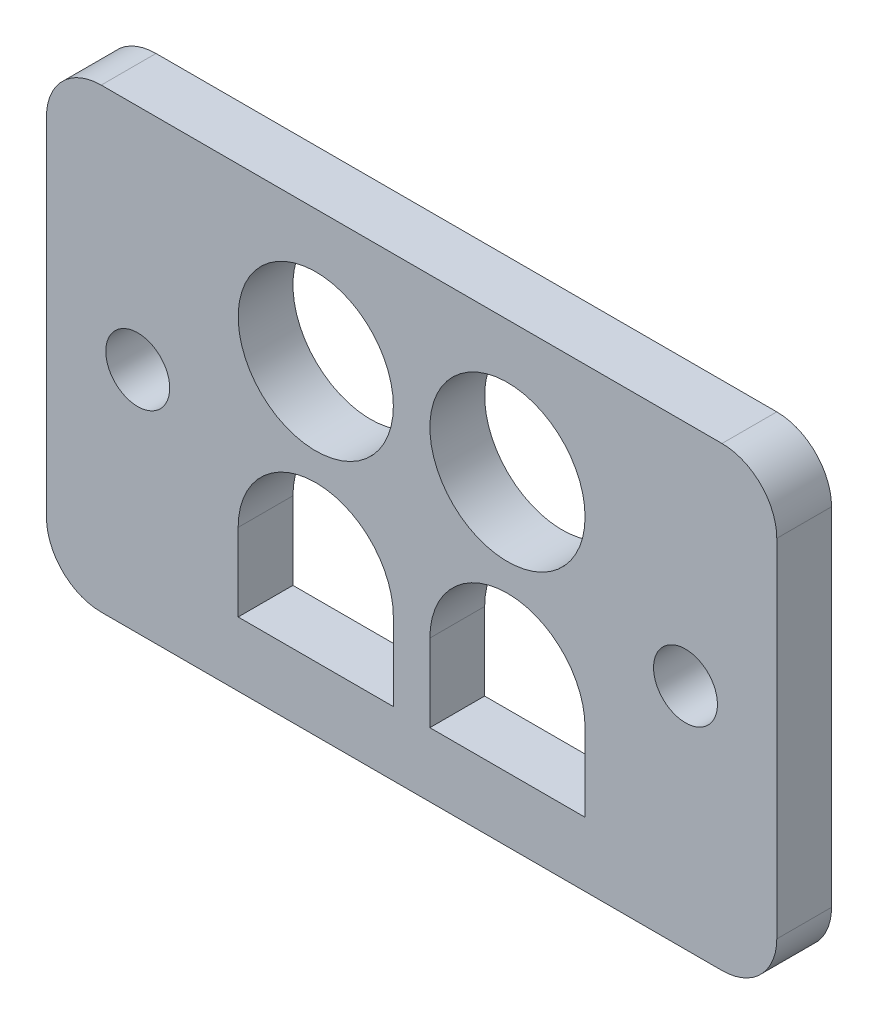
ISO-10303-21;
HEADER;
FILE_DESCRIPTION(('STEP AP214'),'2;1');
FILE_NAME('part.step','',(''),(''),'','','');
FILE_SCHEMA(('AUTOMOTIVE_DESIGN { 1 0 10303 214 1 1 1 1 }'));
ENDSEC;
DATA;
#1=APPLICATION_CONTEXT('core data for automotive mechanical design processes');
#2=APPLICATION_PROTOCOL_DEFINITION('international standard','automotive_design',2000,#1);
#3=PRODUCT_CONTEXT('',#1,'mechanical');
#4=PRODUCT('Part','Part','',(#3));
#5=PRODUCT_RELATED_PRODUCT_CATEGORY('part','',(#4));
#6=PRODUCT_DEFINITION_FORMATION('','',#4);
#7=PRODUCT_DEFINITION_CONTEXT('part definition',#1,'design');
#8=PRODUCT_DEFINITION('design','',#6,#7);
#9=PRODUCT_DEFINITION_SHAPE('','',#8);
#10=(LENGTH_UNIT() NAMED_UNIT(*) SI_UNIT(.MILLI.,.METRE.));
#11=(NAMED_UNIT(*) PLANE_ANGLE_UNIT() SI_UNIT($,.RADIAN.));
#12=(NAMED_UNIT(*) SI_UNIT($,.STERADIAN.) SOLID_ANGLE_UNIT());
#13=UNCERTAINTY_MEASURE_WITH_UNIT(LENGTH_MEASURE(1.E-05),#10,'distance_accuracy_value','');
#14=(GEOMETRIC_REPRESENTATION_CONTEXT(3) GLOBAL_UNCERTAINTY_ASSIGNED_CONTEXT((#13)) GLOBAL_UNIT_ASSIGNED_CONTEXT((#10,
#11,#12)) REPRESENTATION_CONTEXT('',''));
#15=CARTESIAN_POINT('',(0.,0.,0.));
#16=DIRECTION('',(0.,0.,1.));
#17=DIRECTION('',(1.,0.,0.));
#18=AXIS2_PLACEMENT_3D('',#15,#16,#17);
#19=CARTESIAN_POINT('',(-17.,-9.5,3.));
#20=DIRECTION('',(0.,0.,-1.));
#21=DIRECTION('',(-1.,0.,0.));
#22=AXIS2_PLACEMENT_3D('',#19,#20,#21);
#23=CYLINDRICAL_SURFACE('',#22,3.);
#24=CARTESIAN_POINT('',(-17.,-9.5,0.));
#25=DIRECTION('',(0.,0.,1.));
#26=DIRECTION('',(1.,0.,0.));
#27=AXIS2_PLACEMENT_3D('',#24,#25,#26);
#28=CIRCLE('',#27,3.);
#29=CARTESIAN_POINT('',(-20.,-9.49999999999998,0.));
#30=VERTEX_POINT('',#29);
#31=CARTESIAN_POINT('',(-17.,-12.5,0.));
#32=VERTEX_POINT('',#31);
#33=EDGE_CURVE('E221',#30,#32,#28,.T.);
#34=ORIENTED_EDGE('',*,*,#33,.T.);
#35=DIRECTION('',(0.,0.,-1.));
#36=VECTOR('',#35,1.);
#37=CARTESIAN_POINT('',(-17.,-12.5,3.));
#38=LINE('',#37,#36);
#39=CARTESIAN_POINT('',(-17.,-12.5,3.));
#40=VERTEX_POINT('',#39);
#41=EDGE_CURVE('E11',#40,#32,#38,.T.);
#42=ORIENTED_EDGE('',*,*,#41,.F.);
#43=CARTESIAN_POINT('',(-17.,-9.5,3.));
#44=DIRECTION('',(0.,0.,1.));
#45=DIRECTION('',(1.,0.,0.));
#46=AXIS2_PLACEMENT_3D('',#43,#44,#45);
#47=CIRCLE('',#46,3.);
#48=CARTESIAN_POINT('',(-20.,-9.49999999999998,3.));
#49=VERTEX_POINT('',#48);
#50=EDGE_CURVE('E226',#49,#40,#47,.T.);
#51=ORIENTED_EDGE('',*,*,#50,.F.);
#52=DIRECTION('',(0.,0.,-1.));
#53=VECTOR('',#52,1.);
#54=CARTESIAN_POINT('',(-20.,-9.49999999999998,3.));
#55=LINE('',#54,#53);
#56=EDGE_CURVE('E244',#49,#30,#55,.T.);
#57=ORIENTED_EDGE('',*,*,#56,.T.);
#58=EDGE_LOOP('',(#34,#42,#51,#57));
#59=FACE_BOUND('',#58,.T.);
#60=ADVANCED_FACE('F33',(#59),#23,.T.);
#61=CARTESIAN_POINT('',(-17.,-12.5,3.));
#62=DIRECTION('',(0.,1.,0.));
#63=DIRECTION('',(0.,0.,1.));
#64=AXIS2_PLACEMENT_3D('',#61,#62,#63);
#65=PLANE('',#64);
#66=DIRECTION('',(1.,0.,0.));
#67=VECTOR('',#66,1.);
#68=CARTESIAN_POINT('',(-17.,-12.5,0.));
#69=LINE('',#68,#67);
#70=CARTESIAN_POINT('',(17.,-12.5,0.));
#71=VERTEX_POINT('',#70);
#72=EDGE_CURVE('E247',#32,#71,#69,.T.);
#73=ORIENTED_EDGE('',*,*,#72,.T.);
#74=DIRECTION('',(0.,0.,-1.));
#75=VECTOR('',#74,1.);
#76=CARTESIAN_POINT('',(17.,-12.5,3.));
#77=LINE('',#76,#75);
#78=CARTESIAN_POINT('',(17.,-12.5,3.));
#79=VERTEX_POINT('',#78);
#80=EDGE_CURVE('E40',#79,#71,#77,.T.);
#81=ORIENTED_EDGE('',*,*,#80,.F.);
#82=DIRECTION('',(1.,0.,0.));
#83=VECTOR('',#82,1.);
#84=CARTESIAN_POINT('',(-17.,-12.5,3.));
#85=LINE('',#84,#83);
#86=EDGE_CURVE('E229',#40,#79,#85,.T.);
#87=ORIENTED_EDGE('',*,*,#86,.F.);
#88=ORIENTED_EDGE('',*,*,#41,.T.);
#89=EDGE_LOOP('',(#73,#81,#87,#88));
#90=FACE_BOUND('',#89,.T.);
#91=ADVANCED_FACE('F303',(#90),#65,.F.);
#92=CARTESIAN_POINT('',(17.,-9.5,3.));
#93=DIRECTION('',(0.,0.,-1.));
#94=DIRECTION('',(-1.,0.,0.));
#95=AXIS2_PLACEMENT_3D('',#92,#93,#94);
#96=CYLINDRICAL_SURFACE('',#95,3.);
#97=CARTESIAN_POINT('',(17.,-9.5,0.));
#98=DIRECTION('',(0.,0.,1.));
#99=DIRECTION('',(1.,0.,0.));
#100=AXIS2_PLACEMENT_3D('',#97,#98,#99);
#101=CIRCLE('',#100,3.);
#102=CARTESIAN_POINT('',(20.,-9.49999999999998,0.));
#103=VERTEX_POINT('',#102);
#104=EDGE_CURVE('E249',#71,#103,#101,.T.);
#105=ORIENTED_EDGE('',*,*,#104,.T.);
#106=DIRECTION('',(0.,0.,-1.));
#107=VECTOR('',#106,1.);
#108=CARTESIAN_POINT('',(20.,-9.49999999999998,3.));
#109=LINE('',#108,#107);
#110=CARTESIAN_POINT('',(20.,-9.49999999999998,3.));
#111=VERTEX_POINT('',#110);
#112=EDGE_CURVE('E274',#111,#103,#109,.T.);
#113=ORIENTED_EDGE('',*,*,#112,.F.);
#114=CARTESIAN_POINT('',(17.,-9.5,3.));
#115=DIRECTION('',(0.,0.,1.));
#116=DIRECTION('',(1.,0.,0.));
#117=AXIS2_PLACEMENT_3D('',#114,#115,#116);
#118=CIRCLE('',#117,3.);
#119=EDGE_CURVE('E232',#79,#111,#118,.T.);
#120=ORIENTED_EDGE('',*,*,#119,.F.);
#121=ORIENTED_EDGE('',*,*,#80,.T.);
#122=EDGE_LOOP('',(#105,#113,#120,#121));
#123=FACE_BOUND('',#122,.T.);
#124=ADVANCED_FACE('F281',(#123),#96,.T.);
#125=CARTESIAN_POINT('',(20.,9.49999999999998,3.));
#126=DIRECTION('',(-1.,0.,0.));
#127=DIRECTION('',(0.,-1.,0.));
#128=AXIS2_PLACEMENT_3D('',#125,#126,#127);
#129=PLANE('',#128);
#130=DIRECTION('',(0.,1.,0.));
#131=VECTOR('',#130,1.);
#132=CARTESIAN_POINT('',(20.,9.49999999999998,0.));
#133=LINE('',#132,#131);
#134=CARTESIAN_POINT('',(20.,9.49999999999998,0.));
#135=VERTEX_POINT('',#134);
#136=EDGE_CURVE('E251',#103,#135,#133,.T.);
#137=ORIENTED_EDGE('',*,*,#136,.T.);
#138=DIRECTION('',(0.,0.,-1.));
#139=VECTOR('',#138,1.);
#140=CARTESIAN_POINT('',(20.,9.49999999999998,3.));
#141=LINE('',#140,#139);
#142=CARTESIAN_POINT('',(20.,9.49999999999998,3.));
#143=VERTEX_POINT('',#142);
#144=EDGE_CURVE('E271',#143,#135,#141,.T.);
#145=ORIENTED_EDGE('',*,*,#144,.F.);
#146=DIRECTION('',(0.,1.,0.));
#147=VECTOR('',#146,1.);
#148=CARTESIAN_POINT('',(20.,9.49999999999998,3.));
#149=LINE('',#148,#147);
#150=EDGE_CURVE('E234',#111,#143,#149,.T.);
#151=ORIENTED_EDGE('',*,*,#150,.F.);
#152=ORIENTED_EDGE('',*,*,#112,.T.);
#153=EDGE_LOOP('',(#137,#145,#151,#152));
#154=FACE_BOUND('',#153,.T.);
#155=ADVANCED_FACE('F291',(#154),#129,.F.);
#156=CARTESIAN_POINT('',(17.,9.5,3.));
#157=DIRECTION('',(0.,0.,-1.));
#158=DIRECTION('',(-1.,0.,0.));
#159=AXIS2_PLACEMENT_3D('',#156,#157,#158);
#160=CYLINDRICAL_SURFACE('',#159,3.);
#161=CARTESIAN_POINT('',(17.,9.5,0.));
#162=DIRECTION('',(0.,0.,1.));
#163=DIRECTION('',(-1.,0.,0.));
#164=AXIS2_PLACEMENT_3D('',#161,#162,#163);
#165=CIRCLE('',#164,3.);
#166=CARTESIAN_POINT('',(17.,12.5,0.));
#167=VERTEX_POINT('',#166);
#168=EDGE_CURVE('E253',#135,#167,#165,.T.);
#169=ORIENTED_EDGE('',*,*,#168,.T.);
#170=DIRECTION('',(0.,0.,-1.));
#171=VECTOR('',#170,1.);
#172=CARTESIAN_POINT('',(17.,12.5,3.));
#173=LINE('',#172,#171);
#174=CARTESIAN_POINT('',(17.,12.5,3.));
#175=VERTEX_POINT('',#174);
#176=EDGE_CURVE('E268',#175,#167,#173,.T.);
#177=ORIENTED_EDGE('',*,*,#176,.F.);
#178=CARTESIAN_POINT('',(17.,9.5,3.));
#179=DIRECTION('',(0.,0.,1.));
#180=DIRECTION('',(-1.,0.,0.));
#181=AXIS2_PLACEMENT_3D('',#178,#179,#180);
#182=CIRCLE('',#181,3.);
#183=EDGE_CURVE('E236',#143,#175,#182,.T.);
#184=ORIENTED_EDGE('',*,*,#183,.F.);
#185=ORIENTED_EDGE('',*,*,#144,.T.);
#186=EDGE_LOOP('',(#169,#177,#184,#185));
#187=FACE_BOUND('',#186,.T.);
#188=ADVANCED_FACE('F295',(#187),#160,.T.);
#189=CARTESIAN_POINT('',(-17.,12.5,3.));
#190=DIRECTION('',(0.,-1.,0.));
#191=DIRECTION('',(0.,0.,-1.));
#192=AXIS2_PLACEMENT_3D('',#189,#190,#191);
#193=PLANE('',#192);
#194=DIRECTION('',(-1.,0.,0.));
#195=VECTOR('',#194,1.);
#196=CARTESIAN_POINT('',(-17.,12.5,0.));
#197=LINE('',#196,#195);
#198=CARTESIAN_POINT('',(-17.,12.5,0.));
#199=VERTEX_POINT('',#198);
#200=EDGE_CURVE('E255',#167,#199,#197,.T.);
#201=ORIENTED_EDGE('',*,*,#200,.T.);
#202=DIRECTION('',(0.,0.,-1.));
#203=VECTOR('',#202,1.);
#204=CARTESIAN_POINT('',(-17.,12.5,3.));
#205=LINE('',#204,#203);
#206=CARTESIAN_POINT('',(-17.,12.5,3.));
#207=VERTEX_POINT('',#206);
#208=EDGE_CURVE('E265',#207,#199,#205,.T.);
#209=ORIENTED_EDGE('',*,*,#208,.F.);
#210=DIRECTION('',(-1.,0.,0.));
#211=VECTOR('',#210,1.);
#212=CARTESIAN_POINT('',(-17.,12.5,3.));
#213=LINE('',#212,#211);
#214=EDGE_CURVE('E238',#175,#207,#213,.T.);
#215=ORIENTED_EDGE('',*,*,#214,.F.);
#216=ORIENTED_EDGE('',*,*,#176,.T.);
#217=EDGE_LOOP('',(#201,#209,#215,#216));
#218=FACE_BOUND('',#217,.T.);
#219=ADVANCED_FACE('F316',(#218),#193,.F.);
#220=CARTESIAN_POINT('',(-17.,9.5,3.));
#221=DIRECTION('',(0.,0.,-1.));
#222=DIRECTION('',(-1.,0.,0.));
#223=AXIS2_PLACEMENT_3D('',#220,#221,#222);
#224=CYLINDRICAL_SURFACE('',#223,3.);
#225=CARTESIAN_POINT('',(-17.,9.5,0.));
#226=DIRECTION('',(0.,0.,1.));
#227=DIRECTION('',(1.,0.,0.));
#228=AXIS2_PLACEMENT_3D('',#225,#226,#227);
#229=CIRCLE('',#228,3.);
#230=CARTESIAN_POINT('',(-20.,9.49999999999998,0.));
#231=VERTEX_POINT('',#230);
#232=EDGE_CURVE('E257',#199,#231,#229,.T.);
#233=ORIENTED_EDGE('',*,*,#232,.T.);
#234=DIRECTION('',(0.,0.,-1.));
#235=VECTOR('',#234,1.);
#236=CARTESIAN_POINT('',(-20.,9.49999999999998,3.));
#237=LINE('',#236,#235);
#238=CARTESIAN_POINT('',(-20.,9.49999999999998,3.));
#239=VERTEX_POINT('',#238);
#240=EDGE_CURVE('E262',#239,#231,#237,.T.);
#241=ORIENTED_EDGE('',*,*,#240,.F.);
#242=CARTESIAN_POINT('',(-17.,9.5,3.));
#243=DIRECTION('',(0.,0.,1.));
#244=DIRECTION('',(1.,0.,0.));
#245=AXIS2_PLACEMENT_3D('',#242,#243,#244);
#246=CIRCLE('',#245,3.);
#247=EDGE_CURVE('E240',#207,#239,#246,.T.);
#248=ORIENTED_EDGE('',*,*,#247,.F.);
#249=ORIENTED_EDGE('',*,*,#208,.T.);
#250=EDGE_LOOP('',(#233,#241,#248,#249));
#251=FACE_BOUND('',#250,.T.);
#252=ADVANCED_FACE('F314',(#251),#224,.T.);
#253=CARTESIAN_POINT('',(-20.,9.49999999999998,3.));
#254=DIRECTION('',(1.,0.,0.));
#255=DIRECTION('',(0.,1.,0.));
#256=AXIS2_PLACEMENT_3D('',#253,#254,#255);
#257=PLANE('',#256);
#258=DIRECTION('',(0.,-1.,0.));
#259=VECTOR('',#258,1.);
#260=CARTESIAN_POINT('',(-20.,9.49999999999998,0.));
#261=LINE('',#260,#259);
#262=EDGE_CURVE('E230',#231,#30,#261,.T.);
#263=ORIENTED_EDGE('',*,*,#262,.T.);
#264=ORIENTED_EDGE('',*,*,#56,.F.);
#265=DIRECTION('',(0.,-1.,0.));
#266=VECTOR('',#265,1.);
#267=CARTESIAN_POINT('',(-20.,9.49999999999998,3.));
#268=LINE('',#267,#266);
#269=EDGE_CURVE('E242',#239,#49,#268,.T.);
#270=ORIENTED_EDGE('',*,*,#269,.F.);
#271=ORIENTED_EDGE('',*,*,#240,.T.);
#272=EDGE_LOOP('',(#263,#264,#270,#271));
#273=FACE_BOUND('',#272,.T.);
#274=ADVANCED_FACE('F309',(#273),#257,.F.);
#275=CARTESIAN_POINT('',(-17.,-9.5,3.));
#276=DIRECTION('',(0.,0.,1.));
#277=DIRECTION('',(1.,0.,0.));
#278=AXIS2_PLACEMENT_3D('',#275,#276,#277);
#279=PLANE('',#278);
#280=CARTESIAN_POINT('',(15.,0.,3.));
#281=DIRECTION('',(0.,0.,1.));
#282=DIRECTION('',(1.,0.,0.));
#283=AXIS2_PLACEMENT_3D('',#280,#281,#282);
#284=CIRCLE('',#283,1.75);
#285=CARTESIAN_POINT('',(16.75,0.,3.));
#286=VERTEX_POINT('',#285);
#287=EDGE_CURVE('E504',#286,#286,#284,.T.);
#288=ORIENTED_EDGE('',*,*,#287,.F.);
#289=EDGE_LOOP('',(#288));
#290=FACE_BOUND('',#289,.T.);
#291=CARTESIAN_POINT('',(-15.,0.,3.));
#292=DIRECTION('',(0.,0.,1.));
#293=DIRECTION('',(1.,0.,0.));
#294=AXIS2_PLACEMENT_3D('',#291,#292,#293);
#295=CIRCLE('',#294,1.75);
#296=CARTESIAN_POINT('',(-13.25,0.,3.));
#297=VERTEX_POINT('',#296);
#298=EDGE_CURVE('E506',#297,#297,#295,.T.);
#299=ORIENTED_EDGE('',*,*,#298,.F.);
#300=EDGE_LOOP('',(#299));
#301=FACE_BOUND('',#300,.T.);
#302=CARTESIAN_POINT('',(5.25,5.27,3.));
#303=DIRECTION('',(0.,0.,1.));
#304=DIRECTION('',(1.,0.,0.));
#305=AXIS2_PLACEMENT_3D('',#302,#303,#304);
#306=CIRCLE('',#305,4.25);
#307=CARTESIAN_POINT('',(9.5,5.27,3.));
#308=VERTEX_POINT('',#307);
#309=EDGE_CURVE('E172',#308,#308,#306,.T.);
#310=ORIENTED_EDGE('',*,*,#309,.F.);
#311=EDGE_LOOP('',(#310));
#312=FACE_BOUND('',#311,.T.);
#313=DIRECTION('',(0.,1.,0.));
#314=VECTOR('',#313,1.);
#315=CARTESIAN_POINT('',(-0.999999999999999,-4.73,3.));
#316=LINE('',#315,#314);
#317=CARTESIAN_POINT('',(-0.999999999999999,-8.98,3.));
#318=VERTEX_POINT('',#317);
#319=CARTESIAN_POINT('',(-0.999999999999998,-4.73,3.));
#320=VERTEX_POINT('',#319);
#321=EDGE_CURVE('E47',#318,#320,#316,.T.);
#322=ORIENTED_EDGE('',*,*,#321,.F.);
#323=DIRECTION('',(1.,0.,0.));
#324=VECTOR('',#323,1.);
#325=CARTESIAN_POINT('',(-9.5,-8.98,3.));
#326=LINE('',#325,#324);
#327=CARTESIAN_POINT('',(-9.5,-8.98,3.));
#328=VERTEX_POINT('',#327);
#329=EDGE_CURVE('E166',#328,#318,#326,.T.);
#330=ORIENTED_EDGE('',*,*,#329,.F.);
#331=DIRECTION('',(0.,-1.,0.));
#332=VECTOR('',#331,1.);
#333=CARTESIAN_POINT('',(-9.5,-4.73,3.));
#334=LINE('',#333,#332);
#335=CARTESIAN_POINT('',(-9.5,-4.73,3.));
#336=VERTEX_POINT('',#335);
#337=EDGE_CURVE('E169',#336,#328,#334,.T.);
#338=ORIENTED_EDGE('',*,*,#337,.F.);
#339=CARTESIAN_POINT('',(-5.25,-4.73,3.));
#340=DIRECTION('',(0.,0.,1.));
#341=DIRECTION('',(1.,0.,0.));
#342=AXIS2_PLACEMENT_3D('',#339,#340,#341);
#343=CIRCLE('',#342,4.25);
#344=EDGE_CURVE('E178',#320,#336,#343,.T.);
#345=ORIENTED_EDGE('',*,*,#344,.F.);
#346=EDGE_LOOP('',(#322,#330,#338,#345));
#347=FACE_BOUND('',#346,.T.);
#348=DIRECTION('',(0.,1.,0.));
#349=VECTOR('',#348,1.);
#350=CARTESIAN_POINT('',(9.5,-4.73,3.));
#351=LINE('',#350,#349);
#352=CARTESIAN_POINT('',(9.5,-8.98,3.));
#353=VERTEX_POINT('',#352);
#354=CARTESIAN_POINT('',(9.5,-4.73,3.));
#355=VERTEX_POINT('',#354);
#356=EDGE_CURVE('E55',#353,#355,#351,.T.);
#357=ORIENTED_EDGE('',*,*,#356,.F.);
#358=DIRECTION('',(1.,0.,0.));
#359=VECTOR('',#358,1.);
#360=CARTESIAN_POINT('',(1.,-8.98,3.));
#361=LINE('',#360,#359);
#362=CARTESIAN_POINT('',(1.,-8.98,3.));
#363=VERTEX_POINT('',#362);
#364=EDGE_CURVE('E192',#363,#353,#361,.T.);
#365=ORIENTED_EDGE('',*,*,#364,.F.);
#366=DIRECTION('',(0.,-1.,0.));
#367=VECTOR('',#366,1.);
#368=CARTESIAN_POINT('',(1.,-4.73,3.));
#369=LINE('',#368,#367);
#370=CARTESIAN_POINT('',(1.,-4.73,3.));
#371=VERTEX_POINT('',#370);
#372=EDGE_CURVE('E207',#371,#363,#369,.T.);
#373=ORIENTED_EDGE('',*,*,#372,.F.);
#374=CARTESIAN_POINT('',(5.25,-4.73,3.));
#375=DIRECTION('',(0.,0.,1.));
#376=DIRECTION('',(1.,0.,0.));
#377=AXIS2_PLACEMENT_3D('',#374,#375,#376);
#378=CIRCLE('',#377,4.25);
#379=EDGE_CURVE('E203',#355,#371,#378,.T.);
#380=ORIENTED_EDGE('',*,*,#379,.F.);
#381=EDGE_LOOP('',(#357,#365,#373,#380));
#382=FACE_BOUND('',#381,.T.);
#383=CARTESIAN_POINT('',(-5.25,5.27,3.));
#384=DIRECTION('',(0.,0.,1.));
#385=DIRECTION('',(1.,0.,0.));
#386=AXIS2_PLACEMENT_3D('',#383,#384,#385);
#387=CIRCLE('',#386,4.25);
#388=CARTESIAN_POINT('',(-1.,5.27,3.));
#389=VERTEX_POINT('',#388);
#390=EDGE_CURVE('E222',#389,#389,#387,.T.);
#391=ORIENTED_EDGE('',*,*,#390,.F.);
#392=EDGE_LOOP('',(#391));
#393=FACE_BOUND('',#392,.T.);
#394=ORIENTED_EDGE('',*,*,#50,.T.);
#395=ORIENTED_EDGE('',*,*,#86,.T.);
#396=ORIENTED_EDGE('',*,*,#119,.T.);
#397=ORIENTED_EDGE('',*,*,#150,.T.);
#398=ORIENTED_EDGE('',*,*,#183,.T.);
#399=ORIENTED_EDGE('',*,*,#214,.T.);
#400=ORIENTED_EDGE('',*,*,#247,.T.);
#401=ORIENTED_EDGE('',*,*,#269,.T.);
#402=EDGE_LOOP('',(#394,#395,#396,#397,#398,#399,#400,#401));
#403=FACE_BOUND('',#402,.T.);
#404=ADVANCED_FACE('F299',(#290,#301,#312,#347,#382,#393,#403),#279,.T.);
#405=CARTESIAN_POINT('',(-17.,-9.5,0.));
#406=DIRECTION('',(0.,0.,1.));
#407=DIRECTION('',(1.,0.,0.));
#408=AXIS2_PLACEMENT_3D('',#405,#406,#407);
#409=PLANE('',#408);
#410=CARTESIAN_POINT('',(15.,0.,0.));
#411=DIRECTION('',(0.,0.,1.));
#412=DIRECTION('',(1.,0.,0.));
#413=AXIS2_PLACEMENT_3D('',#410,#411,#412);
#414=CIRCLE('',#413,1.75);
#415=CARTESIAN_POINT('',(16.75,0.,0.));
#416=VERTEX_POINT('',#415);
#417=EDGE_CURVE('E501',#416,#416,#414,.T.);
#418=ORIENTED_EDGE('',*,*,#417,.T.);
#419=EDGE_LOOP('',(#418));
#420=FACE_BOUND('',#419,.T.);
#421=CARTESIAN_POINT('',(-15.,0.,0.));
#422=DIRECTION('',(0.,0.,1.));
#423=DIRECTION('',(1.,0.,0.));
#424=AXIS2_PLACEMENT_3D('',#421,#422,#423);
#425=CIRCLE('',#424,1.75);
#426=CARTESIAN_POINT('',(-13.25,0.,0.));
#427=VERTEX_POINT('',#426);
#428=EDGE_CURVE('E204',#427,#427,#425,.T.);
#429=ORIENTED_EDGE('',*,*,#428,.T.);
#430=EDGE_LOOP('',(#429));
#431=FACE_BOUND('',#430,.T.);
#432=CARTESIAN_POINT('',(5.25,5.27,0.));
#433=DIRECTION('',(0.,0.,1.));
#434=DIRECTION('',(1.,0.,0.));
#435=AXIS2_PLACEMENT_3D('',#432,#433,#434);
#436=CIRCLE('',#435,4.25);
#437=CARTESIAN_POINT('',(9.5,5.27,0.));
#438=VERTEX_POINT('',#437);
#439=EDGE_CURVE('E225',#438,#438,#436,.T.);
#440=ORIENTED_EDGE('',*,*,#439,.T.);
#441=EDGE_LOOP('',(#440));
#442=FACE_BOUND('',#441,.T.);
#443=DIRECTION('',(1.,0.,0.));
#444=VECTOR('',#443,1.);
#445=CARTESIAN_POINT('',(-9.5,-8.98,0.));
#446=LINE('',#445,#444);
#447=CARTESIAN_POINT('',(-9.5,-8.98,0.));
#448=VERTEX_POINT('',#447);
#449=CARTESIAN_POINT('',(-0.999999999999999,-8.98,0.));
#450=VERTEX_POINT('',#449);
#451=EDGE_CURVE('E153',#448,#450,#446,.T.);
#452=ORIENTED_EDGE('',*,*,#451,.T.);
#453=DIRECTION('',(0.,1.,0.));
#454=VECTOR('',#453,1.);
#455=CARTESIAN_POINT('',(-0.999999999999999,-4.73,0.));
#456=LINE('',#455,#454);
#457=CARTESIAN_POINT('',(-0.999999999999998,-4.73,0.));
#458=VERTEX_POINT('',#457);
#459=EDGE_CURVE('E147',#450,#458,#456,.T.);
#460=ORIENTED_EDGE('',*,*,#459,.T.);
#461=CARTESIAN_POINT('',(-5.25,-4.73,0.));
#462=DIRECTION('',(0.,0.,1.));
#463=DIRECTION('',(1.,0.,0.));
#464=AXIS2_PLACEMENT_3D('',#461,#462,#463);
#465=CIRCLE('',#464,4.25);
#466=CARTESIAN_POINT('',(-9.5,-4.73,0.));
#467=VERTEX_POINT('',#466);
#468=EDGE_CURVE('E157',#458,#467,#465,.T.);
#469=ORIENTED_EDGE('',*,*,#468,.T.);
#470=DIRECTION('',(0.,-1.,0.));
#471=VECTOR('',#470,1.);
#472=CARTESIAN_POINT('',(-9.5,-4.73,0.));
#473=LINE('',#472,#471);
#474=EDGE_CURVE('E161',#467,#448,#473,.T.);
#475=ORIENTED_EDGE('',*,*,#474,.T.);
#476=EDGE_LOOP('',(#452,#460,#469,#475));
#477=FACE_BOUND('',#476,.T.);
#478=DIRECTION('',(1.,0.,0.));
#479=VECTOR('',#478,1.);
#480=CARTESIAN_POINT('',(1.,-8.98,0.));
#481=LINE('',#480,#479);
#482=CARTESIAN_POINT('',(1.,-8.98,0.));
#483=VERTEX_POINT('',#482);
#484=CARTESIAN_POINT('',(9.5,-8.98,0.));
#485=VERTEX_POINT('',#484);
#486=EDGE_CURVE('E198',#483,#485,#481,.T.);
#487=ORIENTED_EDGE('',*,*,#486,.T.);
#488=DIRECTION('',(0.,1.,0.));
#489=VECTOR('',#488,1.);
#490=CARTESIAN_POINT('',(9.5,-4.73,0.));
#491=LINE('',#490,#489);
#492=CARTESIAN_POINT('',(9.5,-4.73,0.));
#493=VERTEX_POINT('',#492);
#494=EDGE_CURVE('E188',#485,#493,#491,.T.);
#495=ORIENTED_EDGE('',*,*,#494,.T.);
#496=CARTESIAN_POINT('',(5.25,-4.73,0.));
#497=DIRECTION('',(0.,0.,1.));
#498=DIRECTION('',(1.,0.,0.));
#499=AXIS2_PLACEMENT_3D('',#496,#497,#498);
#500=CIRCLE('',#499,4.25);
#501=CARTESIAN_POINT('',(1.,-4.73,0.));
#502=VERTEX_POINT('',#501);
#503=EDGE_CURVE('E191',#493,#502,#500,.T.);
#504=ORIENTED_EDGE('',*,*,#503,.T.);
#505=DIRECTION('',(0.,-1.,0.));
#506=VECTOR('',#505,1.);
#507=CARTESIAN_POINT('',(1.,-4.73,0.));
#508=LINE('',#507,#506);
#509=EDGE_CURVE('E195',#502,#483,#508,.T.);
#510=ORIENTED_EDGE('',*,*,#509,.T.);
#511=EDGE_LOOP('',(#487,#495,#504,#510));
#512=FACE_BOUND('',#511,.T.);
#513=CARTESIAN_POINT('',(-5.25,5.27,0.));
#514=DIRECTION('',(0.,0.,1.));
#515=DIRECTION('',(1.,0.,0.));
#516=AXIS2_PLACEMENT_3D('',#513,#514,#515);
#517=CIRCLE('',#516,4.25);
#518=CARTESIAN_POINT('',(-1.,5.27,0.));
#519=VERTEX_POINT('',#518);
#520=EDGE_CURVE('E218',#519,#519,#517,.T.);
#521=ORIENTED_EDGE('',*,*,#520,.T.);
#522=EDGE_LOOP('',(#521));
#523=FACE_BOUND('',#522,.T.);
#524=ORIENTED_EDGE('',*,*,#33,.F.);
#525=ORIENTED_EDGE('',*,*,#262,.F.);
#526=ORIENTED_EDGE('',*,*,#232,.F.);
#527=ORIENTED_EDGE('',*,*,#200,.F.);
#528=ORIENTED_EDGE('',*,*,#168,.F.);
#529=ORIENTED_EDGE('',*,*,#136,.F.);
#530=ORIENTED_EDGE('',*,*,#104,.F.);
#531=ORIENTED_EDGE('',*,*,#72,.F.);
#532=EDGE_LOOP('',(#524,#525,#526,#527,#528,#529,#530,#531));
#533=FACE_BOUND('',#532,.T.);
#534=ADVANCED_FACE('F163',(#420,#431,#442,#477,#512,#523,#533),#409,.F.);
#535=CARTESIAN_POINT('',(-5.25,5.27,0.));
#536=DIRECTION('',(0.,0.,1.));
#537=DIRECTION('',(1.,0.,0.));
#538=AXIS2_PLACEMENT_3D('',#535,#536,#537);
#539=CYLINDRICAL_SURFACE('',#538,4.25);
#540=ORIENTED_EDGE('',*,*,#520,.F.);
#541=EDGE_LOOP('',(#540));
#542=FACE_BOUND('',#541,.T.);
#543=ORIENTED_EDGE('',*,*,#390,.T.);
#544=EDGE_LOOP('',(#543));
#545=FACE_BOUND('',#544,.T.);
#546=ADVANCED_FACE('F368',(#542,#545),#539,.F.);
#547=CARTESIAN_POINT('',(9.5,-4.73,0.));
#548=DIRECTION('',(1.,0.,0.));
#549=DIRECTION('',(0.,0.,-1.));
#550=AXIS2_PLACEMENT_3D('',#547,#548,#549);
#551=PLANE('',#550);
#552=ORIENTED_EDGE('',*,*,#356,.T.);
#553=DIRECTION('',(0.,0.,1.));
#554=VECTOR('',#553,1.);
#555=CARTESIAN_POINT('',(9.5,-4.73,0.));
#556=LINE('',#555,#554);
#557=EDGE_CURVE('E201',#493,#355,#556,.T.);
#558=ORIENTED_EDGE('',*,*,#557,.F.);
#559=ORIENTED_EDGE('',*,*,#494,.F.);
#560=DIRECTION('',(0.,0.,1.));
#561=VECTOR('',#560,1.);
#562=CARTESIAN_POINT('',(9.5,-8.98,0.));
#563=LINE('',#562,#561);
#564=EDGE_CURVE('E179',#485,#353,#563,.T.);
#565=ORIENTED_EDGE('',*,*,#564,.T.);
#566=EDGE_LOOP('',(#552,#558,#559,#565));
#567=FACE_BOUND('',#566,.T.);
#568=ADVANCED_FACE('F373',(#567),#551,.F.);
#569=CARTESIAN_POINT('',(1.,-8.98,0.));
#570=DIRECTION('',(0.,-1.,0.));
#571=DIRECTION('',(0.,0.,-1.));
#572=AXIS2_PLACEMENT_3D('',#569,#570,#571);
#573=PLANE('',#572);
#574=ORIENTED_EDGE('',*,*,#364,.T.);
#575=ORIENTED_EDGE('',*,*,#564,.F.);
#576=ORIENTED_EDGE('',*,*,#486,.F.);
#577=DIRECTION('',(0.,0.,1.));
#578=VECTOR('',#577,1.);
#579=CARTESIAN_POINT('',(1.,-8.98,0.));
#580=LINE('',#579,#578);
#581=EDGE_CURVE('E213',#483,#363,#580,.T.);
#582=ORIENTED_EDGE('',*,*,#581,.T.);
#583=EDGE_LOOP('',(#574,#575,#576,#582));
#584=FACE_BOUND('',#583,.T.);
#585=ADVANCED_FACE('F385',(#584),#573,.F.);
#586=CARTESIAN_POINT('',(1.,-4.73,0.));
#587=DIRECTION('',(-1.,0.,0.));
#588=DIRECTION('',(0.,0.,1.));
#589=AXIS2_PLACEMENT_3D('',#586,#587,#588);
#590=PLANE('',#589);
#591=ORIENTED_EDGE('',*,*,#372,.T.);
#592=ORIENTED_EDGE('',*,*,#581,.F.);
#593=ORIENTED_EDGE('',*,*,#509,.F.);
#594=DIRECTION('',(0.,0.,1.));
#595=VECTOR('',#594,1.);
#596=CARTESIAN_POINT('',(1.,-4.73,0.));
#597=LINE('',#596,#595);
#598=EDGE_CURVE('E215',#502,#371,#597,.T.);
#599=ORIENTED_EDGE('',*,*,#598,.T.);
#600=EDGE_LOOP('',(#591,#592,#593,#599));
#601=FACE_BOUND('',#600,.T.);
#602=ADVANCED_FACE('F394',(#601),#590,.F.);
#603=CARTESIAN_POINT('',(5.25,-4.73,0.));
#604=DIRECTION('',(0.,0.,1.));
#605=DIRECTION('',(1.,0.,0.));
#606=AXIS2_PLACEMENT_3D('',#603,#604,#605);
#607=CYLINDRICAL_SURFACE('',#606,4.25);
#608=ORIENTED_EDGE('',*,*,#379,.T.);
#609=ORIENTED_EDGE('',*,*,#598,.F.);
#610=ORIENTED_EDGE('',*,*,#503,.F.);
#611=ORIENTED_EDGE('',*,*,#557,.T.);
#612=EDGE_LOOP('',(#608,#609,#610,#611));
#613=FACE_BOUND('',#612,.T.);
#614=ADVANCED_FACE('F404',(#613),#607,.F.);
#615=CARTESIAN_POINT('',(-0.999999999999999,-4.73,0.));
#616=DIRECTION('',(1.,0.,0.));
#617=DIRECTION('',(0.,0.,-1.));
#618=AXIS2_PLACEMENT_3D('',#615,#616,#617);
#619=PLANE('',#618);
#620=ORIENTED_EDGE('',*,*,#321,.T.);
#621=DIRECTION('',(0.,0.,1.));
#622=VECTOR('',#621,1.);
#623=CARTESIAN_POINT('',(-0.999999999999998,-4.73,0.));
#624=LINE('',#623,#622);
#625=EDGE_CURVE('E143',#458,#320,#624,.T.);
#626=ORIENTED_EDGE('',*,*,#625,.F.);
#627=ORIENTED_EDGE('',*,*,#459,.F.);
#628=DIRECTION('',(0.,0.,1.));
#629=VECTOR('',#628,1.);
#630=CARTESIAN_POINT('',(-0.999999999999999,-8.98,0.));
#631=LINE('',#630,#629);
#632=EDGE_CURVE('E183',#450,#318,#631,.T.);
#633=ORIENTED_EDGE('',*,*,#632,.T.);
#634=EDGE_LOOP('',(#620,#626,#627,#633));
#635=FACE_BOUND('',#634,.T.);
#636=ADVANCED_FACE('F145',(#635),#619,.F.);
#637=CARTESIAN_POINT('',(-9.5,-8.98,0.));
#638=DIRECTION('',(0.,-1.,0.));
#639=DIRECTION('',(0.,0.,-1.));
#640=AXIS2_PLACEMENT_3D('',#637,#638,#639);
#641=PLANE('',#640);
#642=ORIENTED_EDGE('',*,*,#329,.T.);
#643=ORIENTED_EDGE('',*,*,#632,.F.);
#644=ORIENTED_EDGE('',*,*,#451,.F.);
#645=DIRECTION('',(0.,0.,1.));
#646=VECTOR('',#645,1.);
#647=CARTESIAN_POINT('',(-9.5,-8.98,0.));
#648=LINE('',#647,#646);
#649=EDGE_CURVE('E185',#448,#328,#648,.T.);
#650=ORIENTED_EDGE('',*,*,#649,.T.);
#651=EDGE_LOOP('',(#642,#643,#644,#650));
#652=FACE_BOUND('',#651,.T.);
#653=ADVANCED_FACE('F423',(#652),#641,.F.);
#654=CARTESIAN_POINT('',(-9.5,-4.73,0.));
#655=DIRECTION('',(-1.,0.,0.));
#656=DIRECTION('',(0.,-1.,0.));
#657=AXIS2_PLACEMENT_3D('',#654,#655,#656);
#658=PLANE('',#657);
#659=ORIENTED_EDGE('',*,*,#337,.T.);
#660=ORIENTED_EDGE('',*,*,#649,.F.);
#661=ORIENTED_EDGE('',*,*,#474,.F.);
#662=DIRECTION('',(0.,0.,1.));
#663=VECTOR('',#662,1.);
#664=CARTESIAN_POINT('',(-9.5,-4.73,0.));
#665=LINE('',#664,#663);
#666=EDGE_CURVE('E152',#467,#336,#665,.T.);
#667=ORIENTED_EDGE('',*,*,#666,.T.);
#668=EDGE_LOOP('',(#659,#660,#661,#667));
#669=FACE_BOUND('',#668,.T.);
#670=ADVANCED_FACE('F432',(#669),#658,.F.);
#671=CARTESIAN_POINT('',(-5.25,-4.73,0.));
#672=DIRECTION('',(0.,0.,1.));
#673=DIRECTION('',(1.,0.,0.));
#674=AXIS2_PLACEMENT_3D('',#671,#672,#673);
#675=CYLINDRICAL_SURFACE('',#674,4.25);
#676=ORIENTED_EDGE('',*,*,#344,.T.);
#677=ORIENTED_EDGE('',*,*,#666,.F.);
#678=ORIENTED_EDGE('',*,*,#468,.F.);
#679=ORIENTED_EDGE('',*,*,#625,.T.);
#680=EDGE_LOOP('',(#676,#677,#678,#679));
#681=FACE_BOUND('',#680,.T.);
#682=ADVANCED_FACE('F158',(#681),#675,.F.);
#683=CARTESIAN_POINT('',(5.25,5.27,0.));
#684=DIRECTION('',(0.,0.,1.));
#685=DIRECTION('',(1.,0.,0.));
#686=AXIS2_PLACEMENT_3D('',#683,#684,#685);
#687=CYLINDRICAL_SURFACE('',#686,4.25);
#688=ORIENTED_EDGE('',*,*,#439,.F.);
#689=EDGE_LOOP('',(#688));
#690=FACE_BOUND('',#689,.T.);
#691=ORIENTED_EDGE('',*,*,#309,.T.);
#692=EDGE_LOOP('',(#691));
#693=FACE_BOUND('',#692,.T.);
#694=ADVANCED_FACE('F451',(#690,#693),#687,.F.);
#695=CARTESIAN_POINT('',(-15.,0.,0.));
#696=DIRECTION('',(0.,0.,1.));
#697=DIRECTION('',(1.,0.,0.));
#698=AXIS2_PLACEMENT_3D('',#695,#696,#697);
#699=CYLINDRICAL_SURFACE('',#698,1.75);
#700=ORIENTED_EDGE('',*,*,#428,.F.);
#701=EDGE_LOOP('',(#700));
#702=FACE_BOUND('',#701,.T.);
#703=ORIENTED_EDGE('',*,*,#298,.T.);
#704=EDGE_LOOP('',(#703));
#705=FACE_BOUND('',#704,.T.);
#706=ADVANCED_FACE('F460',(#702,#705),#699,.F.);
#707=CARTESIAN_POINT('',(15.,0.,0.));
#708=DIRECTION('',(0.,0.,1.));
#709=DIRECTION('',(1.,0.,0.));
#710=AXIS2_PLACEMENT_3D('',#707,#708,#709);
#711=CYLINDRICAL_SURFACE('',#710,1.75);
#712=ORIENTED_EDGE('',*,*,#417,.F.);
#713=EDGE_LOOP('',(#712));
#714=FACE_BOUND('',#713,.T.);
#715=ORIENTED_EDGE('',*,*,#287,.T.);
#716=EDGE_LOOP('',(#715));
#717=FACE_BOUND('',#716,.T.);
#718=ADVANCED_FACE('F484',(#714,#717),#711,.F.);
#719=CLOSED_SHELL('',(#60,#91,#124,#155,#188,#219,#252,#274,#404,#534,#546,#568,#585,#602,#614,
#636,#653,#670,#682,#694,#706,#718));
#720=MANIFOLD_SOLID_BREP('B2',#719);
#721=ADVANCED_BREP_SHAPE_REPRESENTATION('',(#18,#720),#14);
#722=SHAPE_DEFINITION_REPRESENTATION(#9,#721);
ENDSEC;
END-ISO-10303-21;
